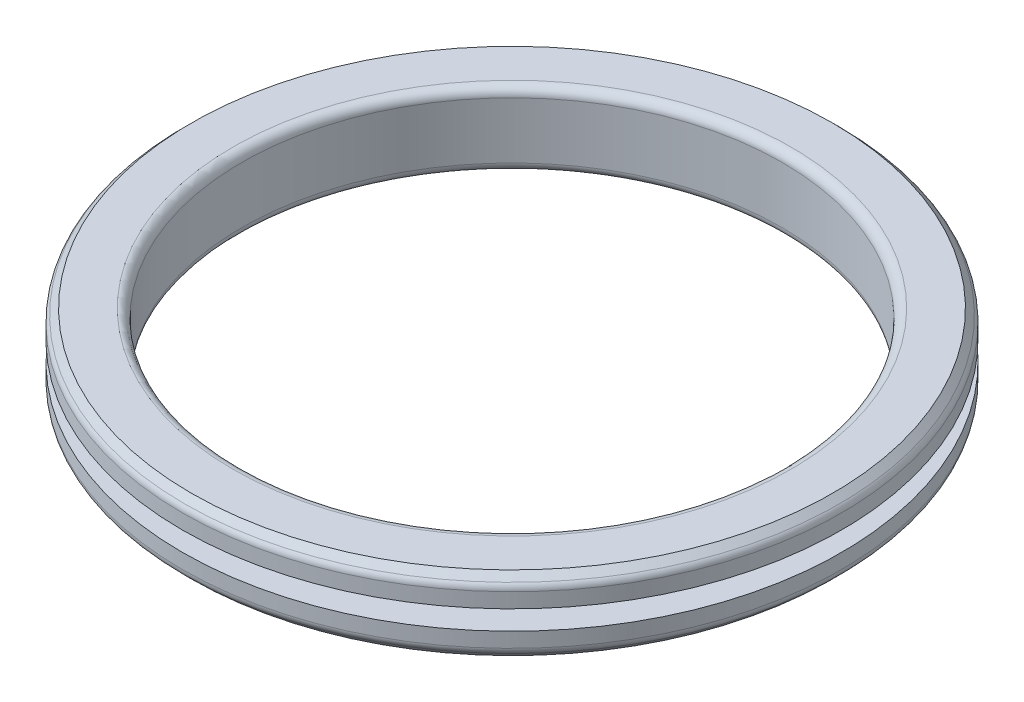
ISO-10303-21;
HEADER;
FILE_DESCRIPTION(('STEP AP214'),'2;1');
FILE_NAME('part.step','',(''),(''),'','','');
FILE_SCHEMA(('AUTOMOTIVE_DESIGN { 1 0 10303 214 1 1 1 1 }'));
ENDSEC;
DATA;
#1=APPLICATION_CONTEXT('core data for automotive mechanical design processes');
#2=APPLICATION_PROTOCOL_DEFINITION('international standard','automotive_design',2000,#1);
#3=PRODUCT_CONTEXT('',#1,'mechanical');
#4=PRODUCT('Part','Part','',(#3));
#5=PRODUCT_RELATED_PRODUCT_CATEGORY('part','',(#4));
#6=PRODUCT_DEFINITION_FORMATION('','',#4);
#7=PRODUCT_DEFINITION_CONTEXT('part definition',#1,'design');
#8=PRODUCT_DEFINITION('design','',#6,#7);
#9=PRODUCT_DEFINITION_SHAPE('','',#8);
#10=(LENGTH_UNIT() NAMED_UNIT(*) SI_UNIT(.MILLI.,.METRE.));
#11=(NAMED_UNIT(*) PLANE_ANGLE_UNIT() SI_UNIT($,.RADIAN.));
#12=(NAMED_UNIT(*) SI_UNIT($,.STERADIAN.) SOLID_ANGLE_UNIT());
#13=UNCERTAINTY_MEASURE_WITH_UNIT(LENGTH_MEASURE(1.E-05),#10,'distance_accuracy_value','');
#14=(GEOMETRIC_REPRESENTATION_CONTEXT(3) GLOBAL_UNCERTAINTY_ASSIGNED_CONTEXT((#13)) GLOBAL_UNIT_ASSIGNED_CONTEXT((#10,
#11,#12)) REPRESENTATION_CONTEXT('',''));
#15=CARTESIAN_POINT('',(0.,0.,0.));
#16=DIRECTION('',(0.,0.,1.));
#17=DIRECTION('',(1.,0.,0.));
#18=AXIS2_PLACEMENT_3D('',#15,#16,#17);
#19=CARTESIAN_POINT('',(0.,2.5,0.));
#20=DIRECTION('',(0.,-1.,0.));
#21=DIRECTION('',(0.,0.,-1.));
#22=AXIS2_PLACEMENT_3D('',#19,#20,#21);
#23=CYLINDRICAL_SURFACE('',#22,11.1);
#24=CARTESIAN_POINT('',(0.,2.07573593128807,0.));
#25=DIRECTION('',(0.,1.,0.));
#26=DIRECTION('',(0.,0.,1.));
#27=AXIS2_PLACEMENT_3D('',#24,#25,#26);
#28=CIRCLE('',#27,11.1);
#29=CARTESIAN_POINT('',(0.,2.07573593128807,11.1));
#30=VERTEX_POINT('',#29);
#31=EDGE_CURVE('E48',#30,#30,#28,.F.);
#32=ORIENTED_EDGE('',*,*,#31,.T.);
#33=EDGE_LOOP('',(#32));
#34=FACE_BOUND('',#33,.T.);
#35=CARTESIAN_POINT('',(0.,1.57573593128807,0.));
#36=DIRECTION('',(0.,-1.,0.));
#37=DIRECTION('',(0.,0.,-1.));
#38=AXIS2_PLACEMENT_3D('',#35,#36,#37);
#39=CIRCLE('',#38,11.1);
#40=CARTESIAN_POINT('',(0.,1.57573593128807,-11.1));
#41=VERTEX_POINT('',#40);
#42=EDGE_CURVE('E39',#41,#41,#39,.T.);
#43=ORIENTED_EDGE('',*,*,#42,.F.);
#44=EDGE_LOOP('',(#43));
#45=FACE_BOUND('',#44,.T.);
#46=ADVANCED_FACE('F35',(#34,#45),#23,.T.);
#47=CARTESIAN_POINT('',(0.,0.42426406871193,0.));
#48=DIRECTION('',(0.,-1.,0.));
#49=DIRECTION('',(0.,0.,-1.));
#50=AXIS2_PLACEMENT_3D('',#47,#48,#49);
#51=CIRCLE('',#50,11.1);
#52=CARTESIAN_POINT('',(0.,0.42426406871193,-11.1));
#53=VERTEX_POINT('',#52);
#54=EDGE_CURVE('E83',#53,#53,#51,.F.);
#55=ORIENTED_EDGE('',*,*,#54,.T.);
#56=EDGE_LOOP('',(#55));
#57=FACE_BOUND('',#56,.T.);
#58=CARTESIAN_POINT('',(0.,0.92426406871193,0.));
#59=DIRECTION('',(0.,1.,0.));
#60=DIRECTION('',(0.,0.,1.));
#61=AXIS2_PLACEMENT_3D('',#58,#59,#60);
#62=CIRCLE('',#61,11.1);
#63=CARTESIAN_POINT('',(0.,0.92426406871193,11.1));
#64=VERTEX_POINT('',#63);
#65=EDGE_CURVE('E51',#64,#64,#62,.T.);
#66=ORIENTED_EDGE('',*,*,#65,.F.);
#67=EDGE_LOOP('',(#66));
#68=FACE_BOUND('',#67,.T.);
#69=ADVANCED_FACE('F105',(#57,#68),#23,.T.);
#70=CARTESIAN_POINT('',(0.,2.5,0.));
#71=DIRECTION('',(0.,1.,0.));
#72=DIRECTION('',(0.,0.,1.));
#73=AXIS2_PLACEMENT_3D('',#70,#71,#72);
#74=PLANE('',#73);
#75=CARTESIAN_POINT('',(0.,2.5,0.));
#76=DIRECTION('',(0.,1.,0.));
#77=DIRECTION('',(0.,0.,1.));
#78=AXIS2_PLACEMENT_3D('',#75,#76,#77);
#79=CIRCLE('',#78,9.4);
#80=CARTESIAN_POINT('',(0.,2.5,9.4));
#81=VERTEX_POINT('',#80);
#82=EDGE_CURVE('E80',#81,#81,#79,.F.);
#83=ORIENTED_EDGE('',*,*,#82,.T.);
#84=EDGE_LOOP('',(#83));
#85=FACE_BOUND('',#84,.T.);
#86=CARTESIAN_POINT('',(0.,2.5,0.));
#87=DIRECTION('',(0.,1.,0.));
#88=DIRECTION('',(0.,0.,1.));
#89=AXIS2_PLACEMENT_3D('',#86,#87,#88);
#90=CIRCLE('',#89,10.8);
#91=CARTESIAN_POINT('',(0.,2.5,10.8));
#92=VERTEX_POINT('',#91);
#93=EDGE_CURVE('E68',#92,#92,#90,.T.);
#94=ORIENTED_EDGE('',*,*,#93,.T.);
#95=EDGE_LOOP('',(#94));
#96=FACE_BOUND('',#95,.T.);
#97=ADVANCED_FACE('F110',(#85,#96),#74,.T.);
#98=CARTESIAN_POINT('',(0.,0.,0.));
#99=DIRECTION('',(0.,1.,0.));
#100=DIRECTION('',(0.,0.,1.));
#101=AXIS2_PLACEMENT_3D('',#98,#99,#100);
#102=PLANE('',#101);
#103=CARTESIAN_POINT('',(0.,0.,0.));
#104=DIRECTION('',(0.,1.,0.));
#105=DIRECTION('',(0.,0.,1.));
#106=AXIS2_PLACEMENT_3D('',#103,#104,#105);
#107=CIRCLE('',#106,9.4);
#108=CARTESIAN_POINT('',(0.,0.,9.4));
#109=VERTEX_POINT('',#108);
#110=EDGE_CURVE('E71',#109,#109,#107,.T.);
#111=ORIENTED_EDGE('',*,*,#110,.T.);
#112=EDGE_LOOP('',(#111));
#113=FACE_BOUND('',#112,.T.);
#114=CARTESIAN_POINT('',(0.,0.,0.));
#115=DIRECTION('',(0.,1.,0.));
#116=DIRECTION('',(0.,0.,1.));
#117=AXIS2_PLACEMENT_3D('',#114,#115,#116);
#118=CIRCLE('',#117,10.8);
#119=CARTESIAN_POINT('',(0.,0.,10.8));
#120=VERTEX_POINT('',#119);
#121=EDGE_CURVE('E57',#120,#120,#118,.F.);
#122=ORIENTED_EDGE('',*,*,#121,.T.);
#123=EDGE_LOOP('',(#122));
#124=FACE_BOUND('',#123,.T.);
#125=ADVANCED_FACE('F114',(#113,#124),#102,.F.);
#126=CARTESIAN_POINT('',(0.,2.5,0.));
#127=DIRECTION('',(0.,-1.,0.));
#128=DIRECTION('',(0.,0.,-1.));
#129=AXIS2_PLACEMENT_3D('',#126,#127,#128);
#130=CYLINDRICAL_SURFACE('',#129,9.1);
#131=CARTESIAN_POINT('',(0.,0.3,0.));
#132=DIRECTION('',(0.,1.,0.));
#133=DIRECTION('',(0.,0.,1.));
#134=AXIS2_PLACEMENT_3D('',#131,#132,#133);
#135=CIRCLE('',#134,9.1);
#136=CARTESIAN_POINT('',(0.,0.3,9.1));
#137=VERTEX_POINT('',#136);
#138=EDGE_CURVE('E77',#137,#137,#135,.F.);
#139=ORIENTED_EDGE('',*,*,#138,.T.);
#140=EDGE_LOOP('',(#139));
#141=FACE_BOUND('',#140,.T.);
#142=CARTESIAN_POINT('',(0.,2.2,0.));
#143=DIRECTION('',(0.,1.,0.));
#144=DIRECTION('',(0.,0.,1.));
#145=AXIS2_PLACEMENT_3D('',#142,#143,#144);
#146=CIRCLE('',#145,9.1);
#147=CARTESIAN_POINT('',(0.,2.2,9.1));
#148=VERTEX_POINT('',#147);
#149=EDGE_CURVE('E74',#148,#148,#146,.T.);
#150=ORIENTED_EDGE('',*,*,#149,.T.);
#151=EDGE_LOOP('',(#150));
#152=FACE_BOUND('',#151,.T.);
#153=ADVANCED_FACE('F124',(#141,#152),#130,.F.);
#154=CARTESIAN_POINT('',(0.,0.300000000000002,0.));
#155=DIRECTION('',(0.,1.,0.));
#156=DIRECTION('',(0.,0.,1.));
#157=AXIS2_PLACEMENT_3D('',#154,#155,#156);
#158=CONICAL_SURFACE('',#157,11.1,0.785398163397448);
#159=CARTESIAN_POINT('',(0.,0.212132034355968,0.));
#160=DIRECTION('',(0.,1.,0.));
#161=DIRECTION('',(0.,0.,1.));
#162=AXIS2_PLACEMENT_3D('',#159,#160,#161);
#163=CIRCLE('',#162,11.012132034356);
#164=CARTESIAN_POINT('',(0.,0.212132034355968,11.012132034356));
#165=VERTEX_POINT('',#164);
#166=EDGE_CURVE('E10',#165,#165,#163,.F.);
#167=ORIENTED_EDGE('',*,*,#166,.T.);
#168=EDGE_LOOP('',(#167));
#169=FACE_BOUND('',#168,.T.);
#170=ORIENTED_EDGE('',*,*,#121,.F.);
#171=EDGE_LOOP('',(#170));
#172=FACE_BOUND('',#171,.T.);
#173=ADVANCED_FACE('F117',(#169,#172),#158,.T.);
#174=CARTESIAN_POINT('',(0.,2.5,0.));
#175=DIRECTION('',(0.,-1.,0.));
#176=DIRECTION('',(0.,0.,-1.));
#177=AXIS2_PLACEMENT_3D('',#174,#175,#176);
#178=CONICAL_SURFACE('',#177,10.8,0.785398163397443);
#179=CARTESIAN_POINT('',(0.,2.28786796564403,0.));
#180=DIRECTION('',(0.,-1.,0.));
#181=DIRECTION('',(0.,0.,-1.));
#182=AXIS2_PLACEMENT_3D('',#179,#180,#181);
#183=CIRCLE('',#182,11.012132034356);
#184=CARTESIAN_POINT('',(0.,2.28786796564403,-11.012132034356));
#185=VERTEX_POINT('',#184);
#186=EDGE_CURVE('E43',#185,#185,#183,.F.);
#187=ORIENTED_EDGE('',*,*,#186,.T.);
#188=EDGE_LOOP('',(#187));
#189=FACE_BOUND('',#188,.T.);
#190=ORIENTED_EDGE('',*,*,#93,.F.);
#191=EDGE_LOOP('',(#190));
#192=FACE_BOUND('',#191,.T.);
#193=ADVANCED_FACE('F123',(#189,#192),#178,.T.);
#194=CARTESIAN_POINT('',(0.,0.3,0.));
#195=DIRECTION('',(0.,1.,0.));
#196=DIRECTION('',(0.,0.,1.));
#197=AXIS2_PLACEMENT_3D('',#194,#195,#196);
#198=TOROIDAL_SURFACE('',#197,9.4,0.3);
#199=ORIENTED_EDGE('',*,*,#138,.F.);
#200=EDGE_LOOP('',(#199));
#201=FACE_BOUND('',#200,.T.);
#202=ORIENTED_EDGE('',*,*,#110,.F.);
#203=EDGE_LOOP('',(#202));
#204=FACE_BOUND('',#203,.T.);
#205=ADVANCED_FACE('F100',(#201,#204),#198,.T.);
#206=CARTESIAN_POINT('',(0.,2.2,0.));
#207=DIRECTION('',(0.,1.,0.));
#208=DIRECTION('',(0.,0.,1.));
#209=AXIS2_PLACEMENT_3D('',#206,#207,#208);
#210=TOROIDAL_SURFACE('',#209,9.4,0.3);
#211=ORIENTED_EDGE('',*,*,#82,.F.);
#212=EDGE_LOOP('',(#211));
#213=FACE_BOUND('',#212,.T.);
#214=ORIENTED_EDGE('',*,*,#149,.F.);
#215=EDGE_LOOP('',(#214));
#216=FACE_BOUND('',#215,.T.);
#217=ADVANCED_FACE('F92',(#213,#216),#210,.T.);
#218=CARTESIAN_POINT('',(0.,2.07573593128807,0.));
#219=DIRECTION('',(0.,1.,0.));
#220=DIRECTION('',(0.,0.,1.));
#221=AXIS2_PLACEMENT_3D('',#218,#219,#220);
#222=TOROIDAL_SURFACE('',#221,10.8,0.3);
#223=ORIENTED_EDGE('',*,*,#186,.F.);
#224=EDGE_LOOP('',(#223));
#225=FACE_BOUND('',#224,.T.);
#226=ORIENTED_EDGE('',*,*,#31,.F.);
#227=EDGE_LOOP('',(#226));
#228=FACE_BOUND('',#227,.T.);
#229=ADVANCED_FACE('F90',(#225,#228),#222,.T.);
#230=CARTESIAN_POINT('',(0.,0.42426406871193,0.));
#231=DIRECTION('',(0.,-1.,0.));
#232=DIRECTION('',(0.,0.,-1.));
#233=AXIS2_PLACEMENT_3D('',#230,#231,#232);
#234=TOROIDAL_SURFACE('',#233,10.8,0.3);
#235=ORIENTED_EDGE('',*,*,#166,.F.);
#236=EDGE_LOOP('',(#235));
#237=FACE_BOUND('',#236,.T.);
#238=ORIENTED_EDGE('',*,*,#54,.F.);
#239=EDGE_LOOP('',(#238));
#240=FACE_BOUND('',#239,.T.);
#241=ADVANCED_FACE('F37',(#237,#240),#234,.T.);
#242=CARTESIAN_POINT('',(0.,1.57573593128807,12.0411785791498));
#243=DIRECTION('',(0.,-1.,0.));
#244=DIRECTION('',(0.,0.,-1.));
#245=AXIS2_PLACEMENT_3D('',#242,#243,#244);
#246=PLANE('',#245);
#247=CARTESIAN_POINT('',(0.,1.57573593128807,0.));
#248=DIRECTION('',(0.,-1.,0.));
#249=DIRECTION('',(0.,0.,-1.));
#250=AXIS2_PLACEMENT_3D('',#247,#248,#249);
#251=CIRCLE('',#250,10.1);
#252=CARTESIAN_POINT('',(0.,1.57573593128807,-10.1));
#253=VERTEX_POINT('',#252);
#254=EDGE_CURVE('E53',#253,#253,#251,.T.);
#255=ORIENTED_EDGE('',*,*,#254,.F.);
#256=EDGE_LOOP('',(#255));
#257=FACE_BOUND('',#256,.T.);
#258=ORIENTED_EDGE('',*,*,#42,.T.);
#259=EDGE_LOOP('',(#258));
#260=FACE_BOUND('',#259,.T.);
#261=ADVANCED_FACE('F98',(#257,#260),#246,.T.);
#262=CARTESIAN_POINT('',(0.,0.92426406871193,12.0411785791498));
#263=DIRECTION('',(0.,1.,0.));
#264=DIRECTION('',(0.,0.,1.));
#265=AXIS2_PLACEMENT_3D('',#262,#263,#264);
#266=PLANE('',#265);
#267=CARTESIAN_POINT('',(0.,0.92426406871193,0.));
#268=DIRECTION('',(0.,-1.,0.));
#269=DIRECTION('',(0.,0.,-1.));
#270=AXIS2_PLACEMENT_3D('',#267,#268,#269);
#271=CIRCLE('',#270,10.1);
#272=CARTESIAN_POINT('',(0.,0.92426406871193,-10.1));
#273=VERTEX_POINT('',#272);
#274=EDGE_CURVE('E59',#273,#273,#271,.T.);
#275=ORIENTED_EDGE('',*,*,#274,.T.);
#276=EDGE_LOOP('',(#275));
#277=FACE_BOUND('',#276,.T.);
#278=ORIENTED_EDGE('',*,*,#65,.T.);
#279=EDGE_LOOP('',(#278));
#280=FACE_BOUND('',#279,.T.);
#281=ADVANCED_FACE('F156',(#277,#280),#266,.T.);
#282=CARTESIAN_POINT('',(0.,-4.29258545350445,0.));
#283=DIRECTION('',(0.,-1.,0.));
#284=DIRECTION('',(0.,0.,-1.));
#285=AXIS2_PLACEMENT_3D('',#282,#283,#284);
#286=CYLINDRICAL_SURFACE('',#285,10.1);
#287=ORIENTED_EDGE('',*,*,#254,.T.);
#288=EDGE_LOOP('',(#287));
#289=FACE_BOUND('',#288,.T.);
#290=ORIENTED_EDGE('',*,*,#274,.F.);
#291=EDGE_LOOP('',(#290));
#292=FACE_BOUND('',#291,.T.);
#293=ADVANCED_FACE('F153',(#289,#292),#286,.T.);
#294=CLOSED_SHELL('',(#46,#69,#97,#125,#153,#173,#193,#205,#217,#229,#241,#261,#281,#293));
#295=MANIFOLD_SOLID_BREP('B2',#294);
#296=ADVANCED_BREP_SHAPE_REPRESENTATION('',(#18,#295),#14);
#297=SHAPE_DEFINITION_REPRESENTATION(#9,#296);
ENDSEC;
END-ISO-10303-21;
